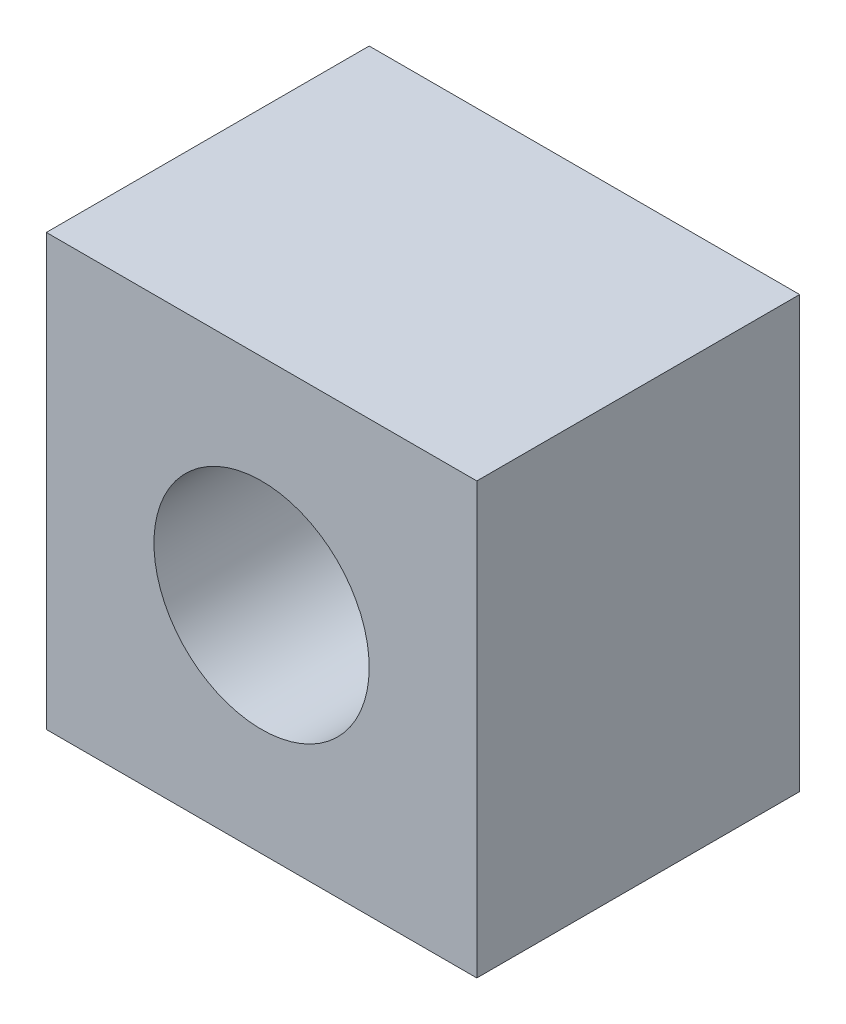
ISO-10303-21;
HEADER;
FILE_DESCRIPTION(('STEP AP214'),'2;1');
FILE_NAME('part.step','',(''),(''),'','','');
FILE_SCHEMA(('AUTOMOTIVE_DESIGN { 1 0 10303 214 1 1 1 1 }'));
ENDSEC;
DATA;
#1=APPLICATION_CONTEXT('core data for automotive mechanical design processes');
#2=APPLICATION_PROTOCOL_DEFINITION('international standard','automotive_design',2000,#1);
#3=PRODUCT_CONTEXT('',#1,'mechanical');
#4=PRODUCT('Part','Part','',(#3));
#5=PRODUCT_RELATED_PRODUCT_CATEGORY('part','',(#4));
#6=PRODUCT_DEFINITION_FORMATION('','',#4);
#7=PRODUCT_DEFINITION_CONTEXT('part definition',#1,'design');
#8=PRODUCT_DEFINITION('design','',#6,#7);
#9=PRODUCT_DEFINITION_SHAPE('','',#8);
#10=(LENGTH_UNIT() NAMED_UNIT(*) SI_UNIT(.MILLI.,.METRE.));
#11=(NAMED_UNIT(*) PLANE_ANGLE_UNIT() SI_UNIT($,.RADIAN.));
#12=(NAMED_UNIT(*) SI_UNIT($,.STERADIAN.) SOLID_ANGLE_UNIT());
#13=UNCERTAINTY_MEASURE_WITH_UNIT(LENGTH_MEASURE(1.E-05),#10,'distance_accuracy_value','');
#14=(GEOMETRIC_REPRESENTATION_CONTEXT(3) GLOBAL_UNCERTAINTY_ASSIGNED_CONTEXT((#13)) GLOBAL_UNIT_ASSIGNED_CONTEXT((#10,
#11,#12)) REPRESENTATION_CONTEXT('',''));
#15=CARTESIAN_POINT('',(0.,0.,0.));
#16=DIRECTION('',(0.,0.,1.));
#17=DIRECTION('',(1.,0.,0.));
#18=AXIS2_PLACEMENT_3D('',#15,#16,#17);
#19=CARTESIAN_POINT('',(0.,0.,6.));
#20=DIRECTION('',(0.,0.,1.));
#21=DIRECTION('',(1.,0.,0.));
#22=AXIS2_PLACEMENT_3D('',#19,#20,#21);
#23=PLANE('',#22);
#24=DIRECTION('',(0.,1.,0.));
#25=VECTOR('',#24,1.);
#26=CARTESIAN_POINT('',(6.,6.,6.));
#27=LINE('',#26,#25);
#28=CARTESIAN_POINT('',(6.,-6.,6.));
#29=VERTEX_POINT('',#28);
#30=CARTESIAN_POINT('',(6.,6.,6.));
#31=VERTEX_POINT('',#30);
#32=EDGE_CURVE('E106',#29,#31,#27,.T.);
#33=ORIENTED_EDGE('',*,*,#32,.T.);
#34=DIRECTION('',(-1.,0.,0.));
#35=VECTOR('',#34,1.);
#36=CARTESIAN_POINT('',(-6.,6.,6.));
#37=LINE('',#36,#35);
#38=CARTESIAN_POINT('',(-6.,6.,6.));
#39=VERTEX_POINT('',#38);
#40=EDGE_CURVE('E79',#31,#39,#37,.T.);
#41=ORIENTED_EDGE('',*,*,#40,.T.);
#42=DIRECTION('',(0.,-1.,0.));
#43=VECTOR('',#42,1.);
#44=CARTESIAN_POINT('',(-6.,6.,6.));
#45=LINE('',#44,#43);
#46=CARTESIAN_POINT('',(-6.,-6.,6.));
#47=VERTEX_POINT('',#46);
#48=EDGE_CURVE('E54',#39,#47,#45,.T.);
#49=ORIENTED_EDGE('',*,*,#48,.T.);
#50=DIRECTION('',(1.,0.,0.));
#51=VECTOR('',#50,1.);
#52=CARTESIAN_POINT('',(-6.,-6.,6.));
#53=LINE('',#52,#51);
#54=EDGE_CURVE('E49',#47,#29,#53,.T.);
#55=ORIENTED_EDGE('',*,*,#54,.T.);
#56=EDGE_LOOP('',(#33,#41,#49,#55));
#57=FACE_BOUND('',#56,.T.);
#58=CARTESIAN_POINT('',(0.,0.,6.));
#59=DIRECTION('',(0.,0.,1.));
#60=DIRECTION('',(1.,0.,0.));
#61=AXIS2_PLACEMENT_3D('',#58,#59,#60);
#62=CIRCLE('',#61,3.);
#63=CARTESIAN_POINT('',(3.,0.,6.));
#64=VERTEX_POINT('',#63);
#65=EDGE_CURVE('E103',#64,#64,#62,.T.);
#66=ORIENTED_EDGE('',*,*,#65,.F.);
#67=EDGE_LOOP('',(#66));
#68=FACE_BOUND('',#67,.T.);
#69=ADVANCED_FACE('F33',(#57,#68),#23,.T.);
#70=CARTESIAN_POINT('',(6.,6.,6.));
#71=DIRECTION('',(-1.,0.,0.));
#72=DIRECTION('',(0.,-1.,0.));
#73=AXIS2_PLACEMENT_3D('',#70,#71,#72);
#74=PLANE('',#73);
#75=DIRECTION('',(0.,0.,-1.));
#76=VECTOR('',#75,1.);
#77=CARTESIAN_POINT('',(6.,-6.,6.));
#78=LINE('',#77,#76);
#79=CARTESIAN_POINT('',(6.,-6.,-3.));
#80=VERTEX_POINT('',#79);
#81=EDGE_CURVE('E84',#29,#80,#78,.T.);
#82=ORIENTED_EDGE('',*,*,#81,.T.);
#83=DIRECTION('',(0.,-1.,0.));
#84=VECTOR('',#83,1.);
#85=CARTESIAN_POINT('',(6.,6.,-3.));
#86=LINE('',#85,#84);
#87=CARTESIAN_POINT('',(6.,6.,-3.));
#88=VERTEX_POINT('',#87);
#89=EDGE_CURVE('E83',#88,#80,#86,.T.);
#90=ORIENTED_EDGE('',*,*,#89,.F.);
#91=DIRECTION('',(0.,0.,-1.));
#92=VECTOR('',#91,1.);
#93=CARTESIAN_POINT('',(6.,6.,6.));
#94=LINE('',#93,#92);
#95=EDGE_CURVE('E11',#31,#88,#94,.T.);
#96=ORIENTED_EDGE('',*,*,#95,.F.);
#97=ORIENTED_EDGE('',*,*,#32,.F.);
#98=EDGE_LOOP('',(#82,#90,#96,#97));
#99=FACE_BOUND('',#98,.T.);
#100=ADVANCED_FACE('F35',(#99),#74,.F.);
#101=CARTESIAN_POINT('',(-6.,6.,6.));
#102=DIRECTION('',(0.,-1.,0.));
#103=DIRECTION('',(0.,0.,-1.));
#104=AXIS2_PLACEMENT_3D('',#101,#102,#103);
#105=PLANE('',#104);
#106=ORIENTED_EDGE('',*,*,#95,.T.);
#107=DIRECTION('',(1.,0.,0.));
#108=VECTOR('',#107,1.);
#109=CARTESIAN_POINT('',(-6.,6.,-3.));
#110=LINE('',#109,#108);
#111=CARTESIAN_POINT('',(-6.,6.,-3.));
#112=VERTEX_POINT('',#111);
#113=EDGE_CURVE('E78',#112,#88,#110,.T.);
#114=ORIENTED_EDGE('',*,*,#113,.F.);
#115=DIRECTION('',(0.,0.,-1.));
#116=VECTOR('',#115,1.);
#117=CARTESIAN_POINT('',(-6.,6.,6.));
#118=LINE('',#117,#116);
#119=EDGE_CURVE('E42',#39,#112,#118,.T.);
#120=ORIENTED_EDGE('',*,*,#119,.F.);
#121=ORIENTED_EDGE('',*,*,#40,.F.);
#122=EDGE_LOOP('',(#106,#114,#120,#121));
#123=FACE_BOUND('',#122,.T.);
#124=ADVANCED_FACE('F75',(#123),#105,.F.);
#125=CARTESIAN_POINT('',(-6.,6.,6.));
#126=DIRECTION('',(1.,0.,0.));
#127=DIRECTION('',(0.,1.,0.));
#128=AXIS2_PLACEMENT_3D('',#125,#126,#127);
#129=PLANE('',#128);
#130=ORIENTED_EDGE('',*,*,#119,.T.);
#131=DIRECTION('',(0.,1.,0.));
#132=VECTOR('',#131,1.);
#133=CARTESIAN_POINT('',(-6.,-6.,-3.));
#134=LINE('',#133,#132);
#135=CARTESIAN_POINT('',(-6.,-6.,-3.));
#136=VERTEX_POINT('',#135);
#137=EDGE_CURVE('E93',#136,#112,#134,.T.);
#138=ORIENTED_EDGE('',*,*,#137,.F.);
#139=DIRECTION('',(0.,0.,-1.));
#140=VECTOR('',#139,1.);
#141=CARTESIAN_POINT('',(-6.,-6.,6.));
#142=LINE('',#141,#140);
#143=EDGE_CURVE('E114',#47,#136,#142,.T.);
#144=ORIENTED_EDGE('',*,*,#143,.F.);
#145=ORIENTED_EDGE('',*,*,#48,.F.);
#146=EDGE_LOOP('',(#130,#138,#144,#145));
#147=FACE_BOUND('',#146,.T.);
#148=ADVANCED_FACE('F117',(#147),#129,.F.);
#149=CARTESIAN_POINT('',(-6.,-6.,6.));
#150=DIRECTION('',(0.,1.,0.));
#151=DIRECTION('',(0.,0.,1.));
#152=AXIS2_PLACEMENT_3D('',#149,#150,#151);
#153=PLANE('',#152);
#154=ORIENTED_EDGE('',*,*,#143,.T.);
#155=DIRECTION('',(-1.,0.,0.));
#156=VECTOR('',#155,1.);
#157=CARTESIAN_POINT('',(6.,-6.,-3.));
#158=LINE('',#157,#156);
#159=EDGE_CURVE('E88',#80,#136,#158,.T.);
#160=ORIENTED_EDGE('',*,*,#159,.F.);
#161=ORIENTED_EDGE('',*,*,#81,.F.);
#162=ORIENTED_EDGE('',*,*,#54,.F.);
#163=EDGE_LOOP('',(#154,#160,#161,#162));
#164=FACE_BOUND('',#163,.T.);
#165=ADVANCED_FACE('F119',(#164),#153,.F.);
#166=CARTESIAN_POINT('',(0.,0.,6.));
#167=DIRECTION('',(0.,0.,-1.));
#168=DIRECTION('',(-1.,0.,0.));
#169=AXIS2_PLACEMENT_3D('',#166,#167,#168);
#170=CYLINDRICAL_SURFACE('',#169,3.);
#171=ORIENTED_EDGE('',*,*,#65,.T.);
#172=EDGE_LOOP('',(#171));
#173=FACE_BOUND('',#172,.T.);
#174=CARTESIAN_POINT('',(0.,0.,0.));
#175=DIRECTION('',(0.,0.,1.));
#176=DIRECTION('',(1.,0.,0.));
#177=AXIS2_PLACEMENT_3D('',#174,#175,#176);
#178=CIRCLE('',#177,3.);
#179=CARTESIAN_POINT('',(3.,0.,0.));
#180=VERTEX_POINT('',#179);
#181=EDGE_CURVE('E102',#180,#180,#178,.T.);
#182=ORIENTED_EDGE('',*,*,#181,.F.);
#183=EDGE_LOOP('',(#182));
#184=FACE_BOUND('',#183,.T.);
#185=ADVANCED_FACE('F125',(#173,#184),#170,.F.);
#186=CARTESIAN_POINT('',(0.,0.,0.));
#187=DIRECTION('',(0.,0.,-1.));
#188=DIRECTION('',(-1.,0.,0.));
#189=AXIS2_PLACEMENT_3D('',#186,#187,#188);
#190=PLANE('',#189);
#191=CARTESIAN_POINT('',(0.,0.,0.));
#192=DIRECTION('',(0.,0.,-1.));
#193=DIRECTION('',(-1.,0.,0.));
#194=AXIS2_PLACEMENT_3D('',#191,#192,#193);
#195=CIRCLE('',#194,1.7);
#196=CARTESIAN_POINT('',(-1.7,0.,0.));
#197=VERTEX_POINT('',#196);
#198=EDGE_CURVE('E37',#197,#197,#195,.T.);
#199=ORIENTED_EDGE('',*,*,#198,.T.);
#200=EDGE_LOOP('',(#199));
#201=FACE_BOUND('',#200,.T.);
#202=ORIENTED_EDGE('',*,*,#181,.T.);
#203=EDGE_LOOP('',(#202));
#204=FACE_BOUND('',#203,.T.);
#205=ADVANCED_FACE('F128',(#201,#204),#190,.F.);
#206=CARTESIAN_POINT('',(0.,0.,-3.));
#207=DIRECTION('',(0.,0.,-1.));
#208=DIRECTION('',(-1.,0.,0.));
#209=AXIS2_PLACEMENT_3D('',#206,#207,#208);
#210=PLANE('',#209);
#211=CARTESIAN_POINT('',(0.,0.,-3.));
#212=DIRECTION('',(0.,0.,-1.));
#213=DIRECTION('',(-1.,0.,0.));
#214=AXIS2_PLACEMENT_3D('',#211,#212,#213);
#215=CIRCLE('',#214,3.5);
#216=CARTESIAN_POINT('',(-3.5,0.,-3.));
#217=VERTEX_POINT('',#216);
#218=EDGE_CURVE('E240',#217,#217,#215,.T.);
#219=ORIENTED_EDGE('',*,*,#218,.F.);
#220=EDGE_LOOP('',(#219));
#221=FACE_BOUND('',#220,.T.);
#222=ORIENTED_EDGE('',*,*,#113,.T.);
#223=ORIENTED_EDGE('',*,*,#89,.T.);
#224=ORIENTED_EDGE('',*,*,#159,.T.);
#225=ORIENTED_EDGE('',*,*,#137,.T.);
#226=EDGE_LOOP('',(#222,#223,#224,#225));
#227=FACE_BOUND('',#226,.T.);
#228=ADVANCED_FACE('F91',(#221,#227),#210,.T.);
#229=CARTESIAN_POINT('',(0.,0.,-3.));
#230=DIRECTION('',(0.,0.,-1.));
#231=DIRECTION('',(-1.,0.,0.));
#232=AXIS2_PLACEMENT_3D('',#229,#230,#231);
#233=CYLINDRICAL_SURFACE('',#232,1.7);
#234=CARTESIAN_POINT('',(0.,0.,-0.600000000000001));
#235=DIRECTION('',(0.,0.,-1.));
#236=DIRECTION('',(-1.,0.,0.));
#237=AXIS2_PLACEMENT_3D('',#234,#235,#236);
#238=CIRCLE('',#237,1.7);
#239=CARTESIAN_POINT('',(-1.7,0.,-0.600000000000001));
#240=VERTEX_POINT('',#239);
#241=EDGE_CURVE('E96',#240,#240,#238,.T.);
#242=ORIENTED_EDGE('',*,*,#241,.T.);
#243=EDGE_LOOP('',(#242));
#244=FACE_BOUND('',#243,.T.);
#245=ORIENTED_EDGE('',*,*,#198,.F.);
#246=EDGE_LOOP('',(#245));
#247=FACE_BOUND('',#246,.T.);
#248=ADVANCED_FACE('F138',(#244,#247),#233,.F.);
#249=CARTESIAN_POINT('',(1.7,0.,-0.600000000000001));
#250=DIRECTION('',(0.,0.,1.));
#251=DIRECTION('',(1.,0.,0.));
#252=AXIS2_PLACEMENT_3D('',#249,#250,#251);
#253=PLANE('',#252);
#254=ORIENTED_EDGE('',*,*,#241,.F.);
#255=EDGE_LOOP('',(#254));
#256=FACE_BOUND('',#255,.T.);
#257=CARTESIAN_POINT('',(0.,0.,-0.600000000000001));
#258=DIRECTION('',(0.,0.,-1.));
#259=DIRECTION('',(-1.,0.,0.));
#260=AXIS2_PLACEMENT_3D('',#257,#258,#259);
#261=CIRCLE('',#260,3.5);
#262=CARTESIAN_POINT('',(-3.5,0.,-0.600000000000001));
#263=VERTEX_POINT('',#262);
#264=EDGE_CURVE('E237',#263,#263,#261,.T.);
#265=ORIENTED_EDGE('',*,*,#264,.T.);
#266=EDGE_LOOP('',(#265));
#267=FACE_BOUND('',#266,.T.);
#268=ADVANCED_FACE('F211',(#256,#267),#253,.F.);
#269=CARTESIAN_POINT('',(0.,0.,-3.));
#270=DIRECTION('',(0.,0.,-1.));
#271=DIRECTION('',(-1.,0.,0.));
#272=AXIS2_PLACEMENT_3D('',#269,#270,#271);
#273=CYLINDRICAL_SURFACE('',#272,3.5);
#274=ORIENTED_EDGE('',*,*,#264,.F.);
#275=EDGE_LOOP('',(#274));
#276=FACE_BOUND('',#275,.T.);
#277=ORIENTED_EDGE('',*,*,#218,.T.);
#278=EDGE_LOOP('',(#277));
#279=FACE_BOUND('',#278,.T.);
#280=ADVANCED_FACE('F219',(#276,#279),#273,.F.);
#281=CLOSED_SHELL('',(#69,#100,#124,#148,#165,#185,#205,#228,#248,#268,#280));
#282=MANIFOLD_SOLID_BREP('B2',#281);
#283=ADVANCED_BREP_SHAPE_REPRESENTATION('',(#18,#282),#14);
#284=SHAPE_DEFINITION_REPRESENTATION(#9,#283);
ENDSEC;
END-ISO-10303-21;
